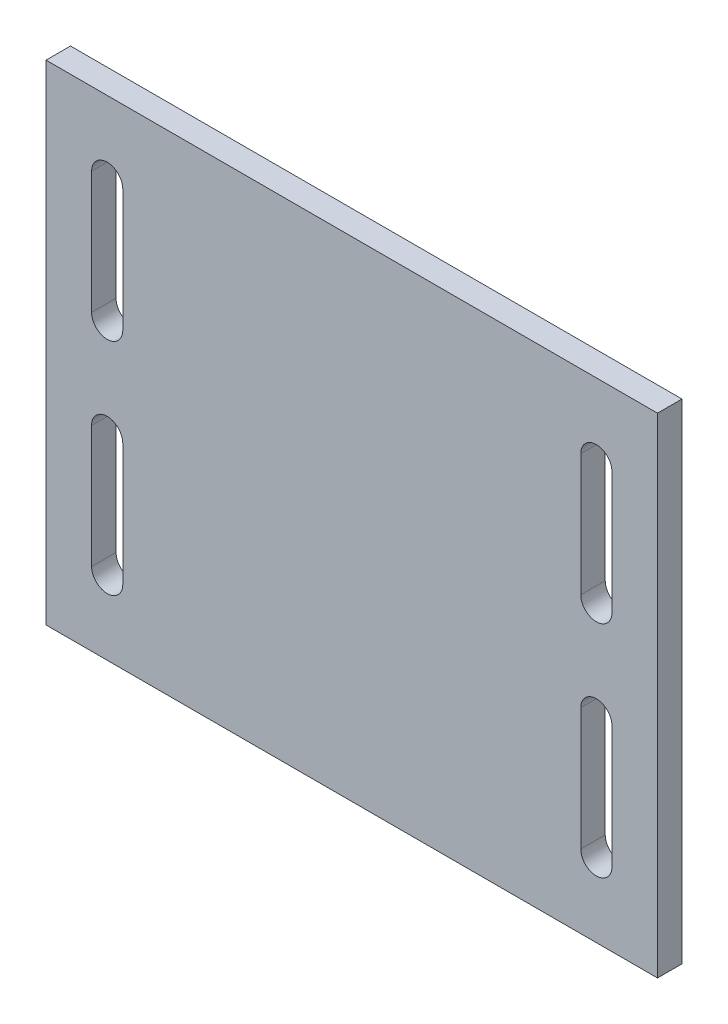
ISO-10303-21;
HEADER;
FILE_DESCRIPTION(('STEP AP214'),'2;1');
FILE_NAME('part.step','',(''),(''),'','','');
FILE_SCHEMA(('AUTOMOTIVE_DESIGN { 1 0 10303 214 1 1 1 1 }'));
ENDSEC;
DATA;
#1=APPLICATION_CONTEXT('core data for automotive mechanical design processes');
#2=APPLICATION_PROTOCOL_DEFINITION('international standard','automotive_design',2000,#1);
#3=PRODUCT_CONTEXT('',#1,'mechanical');
#4=PRODUCT('Part','Part','',(#3));
#5=PRODUCT_RELATED_PRODUCT_CATEGORY('part','',(#4));
#6=PRODUCT_DEFINITION_FORMATION('','',#4);
#7=PRODUCT_DEFINITION_CONTEXT('part definition',#1,'design');
#8=PRODUCT_DEFINITION('design','',#6,#7);
#9=PRODUCT_DEFINITION_SHAPE('','',#8);
#10=(LENGTH_UNIT() NAMED_UNIT(*) SI_UNIT(.MILLI.,.METRE.));
#11=(NAMED_UNIT(*) PLANE_ANGLE_UNIT() SI_UNIT($,.RADIAN.));
#12=(NAMED_UNIT(*) SI_UNIT($,.STERADIAN.) SOLID_ANGLE_UNIT());
#13=UNCERTAINTY_MEASURE_WITH_UNIT(LENGTH_MEASURE(1.E-05),#10,'distance_accuracy_value','');
#14=(GEOMETRIC_REPRESENTATION_CONTEXT(3) GLOBAL_UNCERTAINTY_ASSIGNED_CONTEXT((#13)) GLOBAL_UNIT_ASSIGNED_CONTEXT((#10,
#11,#12)) REPRESENTATION_CONTEXT('',''));
#15=CARTESIAN_POINT('',(0.,0.,0.));
#16=DIRECTION('',(0.,0.,1.));
#17=DIRECTION('',(1.,0.,0.));
#18=AXIS2_PLACEMENT_3D('',#15,#16,#17);
#19=CARTESIAN_POINT('',(0.,0.,4.));
#20=DIRECTION('',(0.,0.,-1.));
#21=DIRECTION('',(-1.,0.,0.));
#22=AXIS2_PLACEMENT_3D('',#19,#20,#21);
#23=PLANE('',#22);
#24=CARTESIAN_POINT('',(90.,68.,4.));
#25=DIRECTION('',(0.,0.,1.));
#26=DIRECTION('',(1.,0.,0.));
#27=AXIS2_PLACEMENT_3D('',#24,#25,#26);
#28=CIRCLE('',#27,2.54999999999998);
#29=CARTESIAN_POINT('',(92.55,68.,4.));
#30=VERTEX_POINT('',#29);
#31=CARTESIAN_POINT('',(87.45,68.,4.));
#32=VERTEX_POINT('',#31);
#33=EDGE_CURVE('E231',#30,#32,#28,.T.);
#34=ORIENTED_EDGE('',*,*,#33,.F.);
#35=DIRECTION('',(0.,1.,0.));
#36=VECTOR('',#35,1.);
#37=CARTESIAN_POINT('',(92.55,68.,4.));
#38=LINE('',#37,#36);
#39=CARTESIAN_POINT('',(92.55,48.,4.));
#40=VERTEX_POINT('',#39);
#41=EDGE_CURVE('E242',#40,#30,#38,.T.);
#42=ORIENTED_EDGE('',*,*,#41,.F.);
#43=CARTESIAN_POINT('',(90.,48.,4.));
#44=DIRECTION('',(0.,0.,1.));
#45=DIRECTION('',(1.,0.,0.));
#46=AXIS2_PLACEMENT_3D('',#43,#44,#45);
#47=CIRCLE('',#46,2.54999999999998);
#48=CARTESIAN_POINT('',(87.45,48.,4.));
#49=VERTEX_POINT('',#48);
#50=EDGE_CURVE('E238',#49,#40,#47,.T.);
#51=ORIENTED_EDGE('',*,*,#50,.F.);
#52=DIRECTION('',(0.,-1.,0.));
#53=VECTOR('',#52,1.);
#54=CARTESIAN_POINT('',(87.45,68.,4.));
#55=LINE('',#54,#53);
#56=EDGE_CURVE('E234',#32,#49,#55,.T.);
#57=ORIENTED_EDGE('',*,*,#56,.F.);
#58=EDGE_LOOP('',(#34,#42,#51,#57));
#59=FACE_BOUND('',#58,.T.);
#60=CARTESIAN_POINT('',(10.,68.,4.));
#61=DIRECTION('',(0.,0.,1.));
#62=DIRECTION('',(1.,0.,0.));
#63=AXIS2_PLACEMENT_3D('',#60,#61,#62);
#64=CIRCLE('',#63,2.55);
#65=CARTESIAN_POINT('',(12.55,68.,4.));
#66=VERTEX_POINT('',#65);
#67=CARTESIAN_POINT('',(7.45,68.,4.));
#68=VERTEX_POINT('',#67);
#69=EDGE_CURVE('E317',#66,#68,#64,.T.);
#70=ORIENTED_EDGE('',*,*,#69,.F.);
#71=DIRECTION('',(0.,1.,0.));
#72=VECTOR('',#71,1.);
#73=CARTESIAN_POINT('',(12.55,68.,4.));
#74=LINE('',#73,#72);
#75=CARTESIAN_POINT('',(12.55,48.,4.));
#76=VERTEX_POINT('',#75);
#77=EDGE_CURVE('E328',#76,#66,#74,.T.);
#78=ORIENTED_EDGE('',*,*,#77,.F.);
#79=CARTESIAN_POINT('',(10.,48.,4.));
#80=DIRECTION('',(0.,0.,1.));
#81=DIRECTION('',(1.,0.,0.));
#82=AXIS2_PLACEMENT_3D('',#79,#80,#81);
#83=CIRCLE('',#82,2.55);
#84=CARTESIAN_POINT('',(7.45,48.,4.));
#85=VERTEX_POINT('',#84);
#86=EDGE_CURVE('E324',#85,#76,#83,.T.);
#87=ORIENTED_EDGE('',*,*,#86,.F.);
#88=DIRECTION('',(0.,-1.,0.));
#89=VECTOR('',#88,1.);
#90=CARTESIAN_POINT('',(7.45,68.,4.));
#91=LINE('',#90,#89);
#92=EDGE_CURVE('E320',#68,#85,#91,.T.);
#93=ORIENTED_EDGE('',*,*,#92,.F.);
#94=EDGE_LOOP('',(#70,#78,#87,#93));
#95=FACE_BOUND('',#94,.T.);
#96=DIRECTION('',(0.,-1.,0.));
#97=VECTOR('',#96,1.);
#98=CARTESIAN_POINT('',(0.,0.,4.));
#99=LINE('',#98,#97);
#100=CARTESIAN_POINT('',(0.,80.,4.));
#101=VERTEX_POINT('',#100);
#102=CARTESIAN_POINT('',(0.,0.,4.));
#103=VERTEX_POINT('',#102);
#104=EDGE_CURVE('E360',#101,#103,#99,.T.);
#105=ORIENTED_EDGE('',*,*,#104,.T.);
#106=DIRECTION('',(1.,0.,0.));
#107=VECTOR('',#106,1.);
#108=CARTESIAN_POINT('',(0.,0.,4.));
#109=LINE('',#108,#107);
#110=CARTESIAN_POINT('',(100.,0.,4.));
#111=VERTEX_POINT('',#110);
#112=EDGE_CURVE('E364',#103,#111,#109,.T.);
#113=ORIENTED_EDGE('',*,*,#112,.T.);
#114=DIRECTION('',(0.,1.,0.));
#115=VECTOR('',#114,1.);
#116=CARTESIAN_POINT('',(100.,0.,4.));
#117=LINE('',#116,#115);
#118=CARTESIAN_POINT('',(100.,80.,4.));
#119=VERTEX_POINT('',#118);
#120=EDGE_CURVE('E368',#111,#119,#117,.T.);
#121=ORIENTED_EDGE('',*,*,#120,.T.);
#122=DIRECTION('',(-1.,0.,0.));
#123=VECTOR('',#122,1.);
#124=CARTESIAN_POINT('',(0.,80.,4.));
#125=LINE('',#124,#123);
#126=EDGE_CURVE('E371',#119,#101,#125,.T.);
#127=ORIENTED_EDGE('',*,*,#126,.T.);
#128=EDGE_LOOP('',(#105,#113,#121,#127));
#129=FACE_BOUND('',#128,.T.);
#130=CARTESIAN_POINT('',(10.,32.,4.));
#131=DIRECTION('',(0.,0.,1.));
#132=DIRECTION('',(1.,0.,0.));
#133=AXIS2_PLACEMENT_3D('',#130,#131,#132);
#134=CIRCLE('',#133,2.55);
#135=CARTESIAN_POINT('',(12.55,32.,4.));
#136=VERTEX_POINT('',#135);
#137=CARTESIAN_POINT('',(7.45,32.,4.));
#138=VERTEX_POINT('',#137);
#139=EDGE_CURVE('E274',#136,#138,#134,.T.);
#140=ORIENTED_EDGE('',*,*,#139,.F.);
#141=DIRECTION('',(0.,1.,0.));
#142=VECTOR('',#141,1.);
#143=CARTESIAN_POINT('',(12.55,32.,4.));
#144=LINE('',#143,#142);
#145=CARTESIAN_POINT('',(12.55,12.,4.));
#146=VERTEX_POINT('',#145);
#147=EDGE_CURVE('E285',#146,#136,#144,.T.);
#148=ORIENTED_EDGE('',*,*,#147,.F.);
#149=CARTESIAN_POINT('',(10.,12.,4.));
#150=DIRECTION('',(0.,0.,1.));
#151=DIRECTION('',(1.,0.,0.));
#152=AXIS2_PLACEMENT_3D('',#149,#150,#151);
#153=CIRCLE('',#152,2.55);
#154=CARTESIAN_POINT('',(7.45,12.,4.));
#155=VERTEX_POINT('',#154);
#156=EDGE_CURVE('E281',#155,#146,#153,.T.);
#157=ORIENTED_EDGE('',*,*,#156,.F.);
#158=DIRECTION('',(0.,-1.,0.));
#159=VECTOR('',#158,1.);
#160=CARTESIAN_POINT('',(7.45,32.,4.));
#161=LINE('',#160,#159);
#162=EDGE_CURVE('E277',#138,#155,#161,.T.);
#163=ORIENTED_EDGE('',*,*,#162,.F.);
#164=EDGE_LOOP('',(#140,#148,#157,#163));
#165=FACE_BOUND('',#164,.T.);
#166=CARTESIAN_POINT('',(90.,32.,4.));
#167=DIRECTION('',(0.,0.,1.));
#168=DIRECTION('',(1.,0.,0.));
#169=AXIS2_PLACEMENT_3D('',#166,#167,#168);
#170=CIRCLE('',#169,2.55);
#171=CARTESIAN_POINT('',(92.55,32.,4.));
#172=VERTEX_POINT('',#171);
#173=CARTESIAN_POINT('',(87.45,32.,4.));
#174=VERTEX_POINT('',#173);
#175=EDGE_CURVE('E183',#172,#174,#170,.T.);
#176=ORIENTED_EDGE('',*,*,#175,.F.);
#177=DIRECTION('',(0.,1.,0.));
#178=VECTOR('',#177,1.);
#179=CARTESIAN_POINT('',(92.55,32.,4.));
#180=LINE('',#179,#178);
#181=CARTESIAN_POINT('',(92.55,12.,4.));
#182=VERTEX_POINT('',#181);
#183=EDGE_CURVE('E209',#182,#172,#180,.T.);
#184=ORIENTED_EDGE('',*,*,#183,.F.);
#185=CARTESIAN_POINT('',(90.,12.,4.));
#186=DIRECTION('',(0.,0.,1.));
#187=DIRECTION('',(1.,0.,0.));
#188=AXIS2_PLACEMENT_3D('',#185,#186,#187);
#189=CIRCLE('',#188,2.54999999999998);
#190=CARTESIAN_POINT('',(87.45,12.,4.));
#191=VERTEX_POINT('',#190);
#192=EDGE_CURVE('E205',#191,#182,#189,.T.);
#193=ORIENTED_EDGE('',*,*,#192,.F.);
#194=DIRECTION('',(0.,-1.,0.));
#195=VECTOR('',#194,1.);
#196=CARTESIAN_POINT('',(87.45,32.,4.));
#197=LINE('',#196,#195);
#198=EDGE_CURVE('E192',#174,#191,#197,.T.);
#199=ORIENTED_EDGE('',*,*,#198,.F.);
#200=EDGE_LOOP('',(#176,#184,#193,#199));
#201=FACE_BOUND('',#200,.T.);
#202=ADVANCED_FACE('F45',(#59,#95,#129,#165,#201),#23,.F.);
#203=CARTESIAN_POINT('',(0.,0.,0.));
#204=DIRECTION('',(0.,0.,-1.));
#205=DIRECTION('',(-1.,0.,0.));
#206=AXIS2_PLACEMENT_3D('',#203,#204,#205);
#207=PLANE('',#206);
#208=DIRECTION('',(0.,-1.,0.));
#209=VECTOR('',#208,1.);
#210=CARTESIAN_POINT('',(0.,0.,0.));
#211=LINE('',#210,#209);
#212=CARTESIAN_POINT('',(0.,80.,0.));
#213=VERTEX_POINT('',#212);
#214=CARTESIAN_POINT('',(0.,0.,0.));
#215=VERTEX_POINT('',#214);
#216=EDGE_CURVE('E359',#213,#215,#211,.T.);
#217=ORIENTED_EDGE('',*,*,#216,.F.);
#218=DIRECTION('',(-1.,0.,0.));
#219=VECTOR('',#218,1.);
#220=CARTESIAN_POINT('',(0.,80.,0.));
#221=LINE('',#220,#219);
#222=CARTESIAN_POINT('',(100.,80.,0.));
#223=VERTEX_POINT('',#222);
#224=EDGE_CURVE('E365',#223,#213,#221,.T.);
#225=ORIENTED_EDGE('',*,*,#224,.F.);
#226=DIRECTION('',(0.,1.,0.));
#227=VECTOR('',#226,1.);
#228=CARTESIAN_POINT('',(100.,0.,0.));
#229=LINE('',#228,#227);
#230=CARTESIAN_POINT('',(100.,0.,0.));
#231=VERTEX_POINT('',#230);
#232=EDGE_CURVE('E381',#231,#223,#229,.T.);
#233=ORIENTED_EDGE('',*,*,#232,.F.);
#234=DIRECTION('',(1.,0.,0.));
#235=VECTOR('',#234,1.);
#236=CARTESIAN_POINT('',(0.,0.,0.));
#237=LINE('',#236,#235);
#238=EDGE_CURVE('E378',#215,#231,#237,.T.);
#239=ORIENTED_EDGE('',*,*,#238,.F.);
#240=EDGE_LOOP('',(#217,#225,#233,#239));
#241=FACE_BOUND('',#240,.T.);
#242=DIRECTION('',(0.,1.,0.));
#243=VECTOR('',#242,1.);
#244=CARTESIAN_POINT('',(12.55,68.,0.));
#245=LINE('',#244,#243);
#246=CARTESIAN_POINT('',(12.55,48.,0.));
#247=VERTEX_POINT('',#246);
#248=CARTESIAN_POINT('',(12.55,68.,0.));
#249=VERTEX_POINT('',#248);
#250=EDGE_CURVE('E321',#247,#249,#245,.T.);
#251=ORIENTED_EDGE('',*,*,#250,.T.);
#252=CARTESIAN_POINT('',(10.,68.,0.));
#253=DIRECTION('',(0.,0.,1.));
#254=DIRECTION('',(1.,0.,0.));
#255=AXIS2_PLACEMENT_3D('',#252,#253,#254);
#256=CIRCLE('',#255,2.55);
#257=CARTESIAN_POINT('',(7.45,68.,0.));
#258=VERTEX_POINT('',#257);
#259=EDGE_CURVE('E316',#249,#258,#256,.T.);
#260=ORIENTED_EDGE('',*,*,#259,.T.);
#261=DIRECTION('',(0.,-1.,0.));
#262=VECTOR('',#261,1.);
#263=CARTESIAN_POINT('',(7.45,68.,0.));
#264=LINE('',#263,#262);
#265=CARTESIAN_POINT('',(7.45,48.,0.));
#266=VERTEX_POINT('',#265);
#267=EDGE_CURVE('E335',#258,#266,#264,.T.);
#268=ORIENTED_EDGE('',*,*,#267,.T.);
#269=CARTESIAN_POINT('',(10.,48.,0.));
#270=DIRECTION('',(0.,0.,1.));
#271=DIRECTION('',(1.,0.,0.));
#272=AXIS2_PLACEMENT_3D('',#269,#270,#271);
#273=CIRCLE('',#272,2.55);
#274=EDGE_CURVE('E339',#266,#247,#273,.T.);
#275=ORIENTED_EDGE('',*,*,#274,.T.);
#276=EDGE_LOOP('',(#251,#260,#268,#275));
#277=FACE_BOUND('',#276,.T.);
#278=DIRECTION('',(0.,1.,0.));
#279=VECTOR('',#278,1.);
#280=CARTESIAN_POINT('',(12.55,32.,0.));
#281=LINE('',#280,#279);
#282=CARTESIAN_POINT('',(12.55,12.,0.));
#283=VERTEX_POINT('',#282);
#284=CARTESIAN_POINT('',(12.55,32.,0.));
#285=VERTEX_POINT('',#284);
#286=EDGE_CURVE('E278',#283,#285,#281,.T.);
#287=ORIENTED_EDGE('',*,*,#286,.T.);
#288=CARTESIAN_POINT('',(10.,32.,0.));
#289=DIRECTION('',(0.,0.,1.));
#290=DIRECTION('',(1.,0.,0.));
#291=AXIS2_PLACEMENT_3D('',#288,#289,#290);
#292=CIRCLE('',#291,2.55);
#293=CARTESIAN_POINT('',(7.45,32.,0.));
#294=VERTEX_POINT('',#293);
#295=EDGE_CURVE('E273',#285,#294,#292,.T.);
#296=ORIENTED_EDGE('',*,*,#295,.T.);
#297=DIRECTION('',(0.,-1.,0.));
#298=VECTOR('',#297,1.);
#299=CARTESIAN_POINT('',(7.45,32.,0.));
#300=LINE('',#299,#298);
#301=CARTESIAN_POINT('',(7.45,12.,0.));
#302=VERTEX_POINT('',#301);
#303=EDGE_CURVE('E292',#294,#302,#300,.T.);
#304=ORIENTED_EDGE('',*,*,#303,.T.);
#305=CARTESIAN_POINT('',(10.,12.,0.));
#306=DIRECTION('',(0.,0.,1.));
#307=DIRECTION('',(1.,0.,0.));
#308=AXIS2_PLACEMENT_3D('',#305,#306,#307);
#309=CIRCLE('',#308,2.55);
#310=EDGE_CURVE('E296',#302,#283,#309,.T.);
#311=ORIENTED_EDGE('',*,*,#310,.T.);
#312=EDGE_LOOP('',(#287,#296,#304,#311));
#313=FACE_BOUND('',#312,.T.);
#314=DIRECTION('',(0.,1.,0.));
#315=VECTOR('',#314,1.);
#316=CARTESIAN_POINT('',(92.55,68.,0.));
#317=LINE('',#316,#315);
#318=CARTESIAN_POINT('',(92.55,48.,0.));
#319=VERTEX_POINT('',#318);
#320=CARTESIAN_POINT('',(92.55,68.,0.));
#321=VERTEX_POINT('',#320);
#322=EDGE_CURVE('E235',#319,#321,#317,.T.);
#323=ORIENTED_EDGE('',*,*,#322,.T.);
#324=CARTESIAN_POINT('',(90.,68.,0.));
#325=DIRECTION('',(0.,0.,1.));
#326=DIRECTION('',(1.,0.,0.));
#327=AXIS2_PLACEMENT_3D('',#324,#325,#326);
#328=CIRCLE('',#327,2.54999999999998);
#329=CARTESIAN_POINT('',(87.45,68.,0.));
#330=VERTEX_POINT('',#329);
#331=EDGE_CURVE('E201',#321,#330,#328,.T.);
#332=ORIENTED_EDGE('',*,*,#331,.T.);
#333=DIRECTION('',(0.,-1.,0.));
#334=VECTOR('',#333,1.);
#335=CARTESIAN_POINT('',(87.45,68.,0.));
#336=LINE('',#335,#334);
#337=CARTESIAN_POINT('',(87.45,48.,0.));
#338=VERTEX_POINT('',#337);
#339=EDGE_CURVE('E249',#330,#338,#336,.T.);
#340=ORIENTED_EDGE('',*,*,#339,.T.);
#341=CARTESIAN_POINT('',(90.,48.,0.));
#342=DIRECTION('',(0.,0.,1.));
#343=DIRECTION('',(1.,0.,0.));
#344=AXIS2_PLACEMENT_3D('',#341,#342,#343);
#345=CIRCLE('',#344,2.54999999999998);
#346=EDGE_CURVE('E253',#338,#319,#345,.T.);
#347=ORIENTED_EDGE('',*,*,#346,.T.);
#348=EDGE_LOOP('',(#323,#332,#340,#347));
#349=FACE_BOUND('',#348,.T.);
#350=DIRECTION('',(0.,1.,0.));
#351=VECTOR('',#350,1.);
#352=CARTESIAN_POINT('',(92.55,32.,0.));
#353=LINE('',#352,#351);
#354=CARTESIAN_POINT('',(92.55,12.,0.));
#355=VERTEX_POINT('',#354);
#356=CARTESIAN_POINT('',(92.55,32.,0.));
#357=VERTEX_POINT('',#356);
#358=EDGE_CURVE('E193',#355,#357,#353,.T.);
#359=ORIENTED_EDGE('',*,*,#358,.T.);
#360=CARTESIAN_POINT('',(90.,32.,0.));
#361=DIRECTION('',(0.,0.,1.));
#362=DIRECTION('',(1.,0.,0.));
#363=AXIS2_PLACEMENT_3D('',#360,#361,#362);
#364=CIRCLE('',#363,2.55);
#365=CARTESIAN_POINT('',(87.45,32.,0.));
#366=VERTEX_POINT('',#365);
#367=EDGE_CURVE('E69',#357,#366,#364,.T.);
#368=ORIENTED_EDGE('',*,*,#367,.T.);
#369=DIRECTION('',(0.,-1.,0.));
#370=VECTOR('',#369,1.);
#371=CARTESIAN_POINT('',(87.45,32.,0.));
#372=LINE('',#371,#370);
#373=CARTESIAN_POINT('',(87.45,12.,0.));
#374=VERTEX_POINT('',#373);
#375=EDGE_CURVE('E199',#366,#374,#372,.T.);
#376=ORIENTED_EDGE('',*,*,#375,.T.);
#377=CARTESIAN_POINT('',(90.,12.,0.));
#378=DIRECTION('',(0.,0.,1.));
#379=DIRECTION('',(1.,0.,0.));
#380=AXIS2_PLACEMENT_3D('',#377,#378,#379);
#381=CIRCLE('',#380,2.54999999999998);
#382=EDGE_CURVE('E218',#374,#355,#381,.T.);
#383=ORIENTED_EDGE('',*,*,#382,.T.);
#384=EDGE_LOOP('',(#359,#368,#376,#383));
#385=FACE_BOUND('',#384,.T.);
#386=ADVANCED_FACE('F404',(#241,#277,#313,#349,#385),#207,.T.);
#387=CARTESIAN_POINT('',(0.,0.,4.));
#388=DIRECTION('',(1.,0.,0.));
#389=DIRECTION('',(0.,0.,-1.));
#390=AXIS2_PLACEMENT_3D('',#387,#388,#389);
#391=PLANE('',#390);
#392=ORIENTED_EDGE('',*,*,#216,.T.);
#393=DIRECTION('',(0.,0.,-1.));
#394=VECTOR('',#393,1.);
#395=CARTESIAN_POINT('',(0.,0.,4.));
#396=LINE('',#395,#394);
#397=EDGE_CURVE('E11',#103,#215,#396,.T.);
#398=ORIENTED_EDGE('',*,*,#397,.F.);
#399=ORIENTED_EDGE('',*,*,#104,.F.);
#400=DIRECTION('',(0.,0.,-1.));
#401=VECTOR('',#400,1.);
#402=CARTESIAN_POINT('',(0.,80.,4.));
#403=LINE('',#402,#401);
#404=EDGE_CURVE('E374',#101,#213,#403,.T.);
#405=ORIENTED_EDGE('',*,*,#404,.T.);
#406=EDGE_LOOP('',(#392,#398,#399,#405));
#407=FACE_BOUND('',#406,.T.);
#408=ADVANCED_FACE('F47',(#407),#391,.F.);
#409=CARTESIAN_POINT('',(0.,0.,4.));
#410=DIRECTION('',(0.,1.,0.));
#411=DIRECTION('',(0.,0.,1.));
#412=AXIS2_PLACEMENT_3D('',#409,#410,#411);
#413=PLANE('',#412);
#414=ORIENTED_EDGE('',*,*,#238,.T.);
#415=DIRECTION('',(0.,0.,-1.));
#416=VECTOR('',#415,1.);
#417=CARTESIAN_POINT('',(100.,0.,4.));
#418=LINE('',#417,#416);
#419=EDGE_CURVE('E54',#111,#231,#418,.T.);
#420=ORIENTED_EDGE('',*,*,#419,.F.);
#421=ORIENTED_EDGE('',*,*,#112,.F.);
#422=ORIENTED_EDGE('',*,*,#397,.T.);
#423=EDGE_LOOP('',(#414,#420,#421,#422));
#424=FACE_BOUND('',#423,.T.);
#425=ADVANCED_FACE('F415',(#424),#413,.F.);
#426=CARTESIAN_POINT('',(100.,0.,4.));
#427=DIRECTION('',(-1.,0.,0.));
#428=DIRECTION('',(0.,0.,1.));
#429=AXIS2_PLACEMENT_3D('',#426,#427,#428);
#430=PLANE('',#429);
#431=ORIENTED_EDGE('',*,*,#232,.T.);
#432=DIRECTION('',(0.,0.,-1.));
#433=VECTOR('',#432,1.);
#434=CARTESIAN_POINT('',(100.,80.,4.));
#435=LINE('',#434,#433);
#436=EDGE_CURVE('E389',#119,#223,#435,.T.);
#437=ORIENTED_EDGE('',*,*,#436,.F.);
#438=ORIENTED_EDGE('',*,*,#120,.F.);
#439=ORIENTED_EDGE('',*,*,#419,.T.);
#440=EDGE_LOOP('',(#431,#437,#438,#439));
#441=FACE_BOUND('',#440,.T.);
#442=ADVANCED_FACE('F398',(#441),#430,.F.);
#443=CARTESIAN_POINT('',(0.,80.,4.));
#444=DIRECTION('',(0.,-1.,0.));
#445=DIRECTION('',(0.,0.,-1.));
#446=AXIS2_PLACEMENT_3D('',#443,#444,#445);
#447=PLANE('',#446);
#448=ORIENTED_EDGE('',*,*,#224,.T.);
#449=ORIENTED_EDGE('',*,*,#404,.F.);
#450=ORIENTED_EDGE('',*,*,#126,.F.);
#451=ORIENTED_EDGE('',*,*,#436,.T.);
#452=EDGE_LOOP('',(#448,#449,#450,#451));
#453=FACE_BOUND('',#452,.T.);
#454=ADVANCED_FACE('F408',(#453),#447,.F.);
#455=CARTESIAN_POINT('',(10.,68.,4.));
#456=DIRECTION('',(0.,0.,-1.));
#457=DIRECTION('',(-1.,0.,0.));
#458=AXIS2_PLACEMENT_3D('',#455,#456,#457);
#459=CYLINDRICAL_SURFACE('',#458,2.55);
#460=ORIENTED_EDGE('',*,*,#259,.F.);
#461=DIRECTION('',(0.,0.,-1.));
#462=VECTOR('',#461,1.);
#463=CARTESIAN_POINT('',(12.55,68.,4.));
#464=LINE('',#463,#462);
#465=EDGE_CURVE('E331',#66,#249,#464,.T.);
#466=ORIENTED_EDGE('',*,*,#465,.F.);
#467=ORIENTED_EDGE('',*,*,#69,.T.);
#468=DIRECTION('',(0.,0.,-1.));
#469=VECTOR('',#468,1.);
#470=CARTESIAN_POINT('',(7.45,68.,4.));
#471=LINE('',#470,#469);
#472=EDGE_CURVE('E355',#68,#258,#471,.T.);
#473=ORIENTED_EDGE('',*,*,#472,.T.);
#474=EDGE_LOOP('',(#460,#466,#467,#473));
#475=FACE_BOUND('',#474,.T.);
#476=ADVANCED_FACE('F432',(#475),#459,.F.);
#477=CARTESIAN_POINT('',(7.45,68.,4.));
#478=DIRECTION('',(1.,0.,0.));
#479=DIRECTION('',(0.,1.,0.));
#480=AXIS2_PLACEMENT_3D('',#477,#478,#479);
#481=PLANE('',#480);
#482=ORIENTED_EDGE('',*,*,#267,.F.);
#483=ORIENTED_EDGE('',*,*,#472,.F.);
#484=ORIENTED_EDGE('',*,*,#92,.T.);
#485=DIRECTION('',(0.,0.,-1.));
#486=VECTOR('',#485,1.);
#487=CARTESIAN_POINT('',(7.45,48.,4.));
#488=LINE('',#487,#486);
#489=EDGE_CURVE('E352',#85,#266,#488,.T.);
#490=ORIENTED_EDGE('',*,*,#489,.T.);
#491=EDGE_LOOP('',(#482,#483,#484,#490));
#492=FACE_BOUND('',#491,.T.);
#493=ADVANCED_FACE('F439',(#492),#481,.T.);
#494=CARTESIAN_POINT('',(10.,48.,4.));
#495=DIRECTION('',(0.,0.,-1.));
#496=DIRECTION('',(-1.,0.,0.));
#497=AXIS2_PLACEMENT_3D('',#494,#495,#496);
#498=CYLINDRICAL_SURFACE('',#497,2.55);
#499=ORIENTED_EDGE('',*,*,#274,.F.);
#500=ORIENTED_EDGE('',*,*,#489,.F.);
#501=ORIENTED_EDGE('',*,*,#86,.T.);
#502=DIRECTION('',(0.,0.,-1.));
#503=VECTOR('',#502,1.);
#504=CARTESIAN_POINT('',(12.55,48.,4.));
#505=LINE('',#504,#503);
#506=EDGE_CURVE('E349',#76,#247,#505,.T.);
#507=ORIENTED_EDGE('',*,*,#506,.T.);
#508=EDGE_LOOP('',(#499,#500,#501,#507));
#509=FACE_BOUND('',#508,.T.);
#510=ADVANCED_FACE('F444',(#509),#498,.F.);
#511=CARTESIAN_POINT('',(12.55,68.,4.));
#512=DIRECTION('',(-1.,0.,0.));
#513=DIRECTION('',(0.,0.,1.));
#514=AXIS2_PLACEMENT_3D('',#511,#512,#513);
#515=PLANE('',#514);
#516=ORIENTED_EDGE('',*,*,#250,.F.);
#517=ORIENTED_EDGE('',*,*,#506,.F.);
#518=ORIENTED_EDGE('',*,*,#77,.T.);
#519=ORIENTED_EDGE('',*,*,#465,.T.);
#520=EDGE_LOOP('',(#516,#517,#518,#519));
#521=FACE_BOUND('',#520,.T.);
#522=ADVANCED_FACE('F451',(#521),#515,.T.);
#523=CARTESIAN_POINT('',(10.,32.,4.));
#524=DIRECTION('',(0.,0.,-1.));
#525=DIRECTION('',(-1.,0.,0.));
#526=AXIS2_PLACEMENT_3D('',#523,#524,#525);
#527=CYLINDRICAL_SURFACE('',#526,2.55);
#528=ORIENTED_EDGE('',*,*,#295,.F.);
#529=DIRECTION('',(0.,0.,-1.));
#530=VECTOR('',#529,1.);
#531=CARTESIAN_POINT('',(12.55,32.,4.));
#532=LINE('',#531,#530);
#533=EDGE_CURVE('E288',#136,#285,#532,.T.);
#534=ORIENTED_EDGE('',*,*,#533,.F.);
#535=ORIENTED_EDGE('',*,*,#139,.T.);
#536=DIRECTION('',(0.,0.,-1.));
#537=VECTOR('',#536,1.);
#538=CARTESIAN_POINT('',(7.45,32.,4.));
#539=LINE('',#538,#537);
#540=EDGE_CURVE('E312',#138,#294,#539,.T.);
#541=ORIENTED_EDGE('',*,*,#540,.T.);
#542=EDGE_LOOP('',(#528,#534,#535,#541));
#543=FACE_BOUND('',#542,.T.);
#544=ADVANCED_FACE('F464',(#543),#527,.F.);
#545=CARTESIAN_POINT('',(7.45,32.,4.));
#546=DIRECTION('',(1.,0.,0.));
#547=DIRECTION('',(0.,1.,0.));
#548=AXIS2_PLACEMENT_3D('',#545,#546,#547);
#549=PLANE('',#548);
#550=ORIENTED_EDGE('',*,*,#303,.F.);
#551=ORIENTED_EDGE('',*,*,#540,.F.);
#552=ORIENTED_EDGE('',*,*,#162,.T.);
#553=DIRECTION('',(0.,0.,-1.));
#554=VECTOR('',#553,1.);
#555=CARTESIAN_POINT('',(7.45,12.,4.));
#556=LINE('',#555,#554);
#557=EDGE_CURVE('E309',#155,#302,#556,.T.);
#558=ORIENTED_EDGE('',*,*,#557,.T.);
#559=EDGE_LOOP('',(#550,#551,#552,#558));
#560=FACE_BOUND('',#559,.T.);
#561=ADVANCED_FACE('F469',(#560),#549,.T.);
#562=CARTESIAN_POINT('',(10.,12.,4.));
#563=DIRECTION('',(0.,0.,-1.));
#564=DIRECTION('',(-1.,0.,0.));
#565=AXIS2_PLACEMENT_3D('',#562,#563,#564);
#566=CYLINDRICAL_SURFACE('',#565,2.55);
#567=ORIENTED_EDGE('',*,*,#310,.F.);
#568=ORIENTED_EDGE('',*,*,#557,.F.);
#569=ORIENTED_EDGE('',*,*,#156,.T.);
#570=DIRECTION('',(0.,0.,-1.));
#571=VECTOR('',#570,1.);
#572=CARTESIAN_POINT('',(12.55,12.,4.));
#573=LINE('',#572,#571);
#574=EDGE_CURVE('E306',#146,#283,#573,.T.);
#575=ORIENTED_EDGE('',*,*,#574,.T.);
#576=EDGE_LOOP('',(#567,#568,#569,#575));
#577=FACE_BOUND('',#576,.T.);
#578=ADVANCED_FACE('F473',(#577),#566,.F.);
#579=CARTESIAN_POINT('',(12.55,32.,4.));
#580=DIRECTION('',(-1.,0.,0.));
#581=DIRECTION('',(0.,-1.,0.));
#582=AXIS2_PLACEMENT_3D('',#579,#580,#581);
#583=PLANE('',#582);
#584=ORIENTED_EDGE('',*,*,#286,.F.);
#585=ORIENTED_EDGE('',*,*,#574,.F.);
#586=ORIENTED_EDGE('',*,*,#147,.T.);
#587=ORIENTED_EDGE('',*,*,#533,.T.);
#588=EDGE_LOOP('',(#584,#585,#586,#587));
#589=FACE_BOUND('',#588,.T.);
#590=ADVANCED_FACE('F477',(#589),#583,.T.);
#591=CARTESIAN_POINT('',(90.,68.,4.));
#592=DIRECTION('',(0.,0.,-1.));
#593=DIRECTION('',(-1.,0.,0.));
#594=AXIS2_PLACEMENT_3D('',#591,#592,#593);
#595=CYLINDRICAL_SURFACE('',#594,2.54999999999998);
#596=ORIENTED_EDGE('',*,*,#331,.F.);
#597=DIRECTION('',(0.,0.,-1.));
#598=VECTOR('',#597,1.);
#599=CARTESIAN_POINT('',(92.55,68.,4.));
#600=LINE('',#599,#598);
#601=EDGE_CURVE('E245',#30,#321,#600,.T.);
#602=ORIENTED_EDGE('',*,*,#601,.F.);
#603=ORIENTED_EDGE('',*,*,#33,.T.);
#604=DIRECTION('',(0.,0.,-1.));
#605=VECTOR('',#604,1.);
#606=CARTESIAN_POINT('',(87.45,68.,4.));
#607=LINE('',#606,#605);
#608=EDGE_CURVE('E269',#32,#330,#607,.T.);
#609=ORIENTED_EDGE('',*,*,#608,.T.);
#610=EDGE_LOOP('',(#596,#602,#603,#609));
#611=FACE_BOUND('',#610,.T.);
#612=ADVANCED_FACE('F481',(#611),#595,.F.);
#613=CARTESIAN_POINT('',(87.45,68.,4.));
#614=DIRECTION('',(1.,0.,0.));
#615=DIRECTION('',(0.,0.,-1.));
#616=AXIS2_PLACEMENT_3D('',#613,#614,#615);
#617=PLANE('',#616);
#618=ORIENTED_EDGE('',*,*,#339,.F.);
#619=ORIENTED_EDGE('',*,*,#608,.F.);
#620=ORIENTED_EDGE('',*,*,#56,.T.);
#621=DIRECTION('',(0.,0.,-1.));
#622=VECTOR('',#621,1.);
#623=CARTESIAN_POINT('',(87.45,48.,4.));
#624=LINE('',#623,#622);
#625=EDGE_CURVE('E266',#49,#338,#624,.T.);
#626=ORIENTED_EDGE('',*,*,#625,.T.);
#627=EDGE_LOOP('',(#618,#619,#620,#626));
#628=FACE_BOUND('',#627,.T.);
#629=ADVANCED_FACE('F485',(#628),#617,.T.);
#630=CARTESIAN_POINT('',(90.,48.,4.));
#631=DIRECTION('',(0.,0.,-1.));
#632=DIRECTION('',(-1.,0.,0.));
#633=AXIS2_PLACEMENT_3D('',#630,#631,#632);
#634=CYLINDRICAL_SURFACE('',#633,2.54999999999998);
#635=ORIENTED_EDGE('',*,*,#346,.F.);
#636=ORIENTED_EDGE('',*,*,#625,.F.);
#637=ORIENTED_EDGE('',*,*,#50,.T.);
#638=DIRECTION('',(0.,0.,-1.));
#639=VECTOR('',#638,1.);
#640=CARTESIAN_POINT('',(92.55,48.,4.));
#641=LINE('',#640,#639);
#642=EDGE_CURVE('E263',#40,#319,#641,.T.);
#643=ORIENTED_EDGE('',*,*,#642,.T.);
#644=EDGE_LOOP('',(#635,#636,#637,#643));
#645=FACE_BOUND('',#644,.T.);
#646=ADVANCED_FACE('F489',(#645),#634,.F.);
#647=CARTESIAN_POINT('',(92.55,68.,4.));
#648=DIRECTION('',(-1.,0.,0.));
#649=DIRECTION('',(0.,0.,1.));
#650=AXIS2_PLACEMENT_3D('',#647,#648,#649);
#651=PLANE('',#650);
#652=ORIENTED_EDGE('',*,*,#322,.F.);
#653=ORIENTED_EDGE('',*,*,#642,.F.);
#654=ORIENTED_EDGE('',*,*,#41,.T.);
#655=ORIENTED_EDGE('',*,*,#601,.T.);
#656=EDGE_LOOP('',(#652,#653,#654,#655));
#657=FACE_BOUND('',#656,.T.);
#658=ADVANCED_FACE('F493',(#657),#651,.T.);
#659=CARTESIAN_POINT('',(90.,32.,4.));
#660=DIRECTION('',(0.,0.,-1.));
#661=DIRECTION('',(-1.,0.,0.));
#662=AXIS2_PLACEMENT_3D('',#659,#660,#661);
#663=CYLINDRICAL_SURFACE('',#662,2.55);
#664=ORIENTED_EDGE('',*,*,#367,.F.);
#665=DIRECTION('',(0.,0.,-1.));
#666=VECTOR('',#665,1.);
#667=CARTESIAN_POINT('',(92.55,32.,4.));
#668=LINE('',#667,#666);
#669=EDGE_CURVE('E187',#172,#357,#668,.T.);
#670=ORIENTED_EDGE('',*,*,#669,.F.);
#671=ORIENTED_EDGE('',*,*,#175,.T.);
#672=DIRECTION('',(0.,0.,-1.));
#673=VECTOR('',#672,1.);
#674=CARTESIAN_POINT('',(87.45,32.,4.));
#675=LINE('',#674,#673);
#676=EDGE_CURVE('E186',#174,#366,#675,.T.);
#677=ORIENTED_EDGE('',*,*,#676,.T.);
#678=EDGE_LOOP('',(#664,#670,#671,#677));
#679=FACE_BOUND('',#678,.T.);
#680=ADVANCED_FACE('F185',(#679),#663,.F.);
#681=CARTESIAN_POINT('',(87.45,32.,4.));
#682=DIRECTION('',(1.,0.,0.));
#683=DIRECTION('',(0.,1.,0.));
#684=AXIS2_PLACEMENT_3D('',#681,#682,#683);
#685=PLANE('',#684);
#686=ORIENTED_EDGE('',*,*,#375,.F.);
#687=ORIENTED_EDGE('',*,*,#676,.F.);
#688=ORIENTED_EDGE('',*,*,#198,.T.);
#689=DIRECTION('',(0.,0.,-1.));
#690=VECTOR('',#689,1.);
#691=CARTESIAN_POINT('',(87.45,12.,4.));
#692=LINE('',#691,#690);
#693=EDGE_CURVE('E202',#191,#374,#692,.T.);
#694=ORIENTED_EDGE('',*,*,#693,.T.);
#695=EDGE_LOOP('',(#686,#687,#688,#694));
#696=FACE_BOUND('',#695,.T.);
#697=ADVANCED_FACE('F196',(#696),#685,.T.);
#698=CARTESIAN_POINT('',(90.,12.,4.));
#699=DIRECTION('',(0.,0.,-1.));
#700=DIRECTION('',(-1.,0.,0.));
#701=AXIS2_PLACEMENT_3D('',#698,#699,#700);
#702=CYLINDRICAL_SURFACE('',#701,2.54999999999998);
#703=ORIENTED_EDGE('',*,*,#382,.F.);
#704=ORIENTED_EDGE('',*,*,#693,.F.);
#705=ORIENTED_EDGE('',*,*,#192,.T.);
#706=DIRECTION('',(0.,0.,-1.));
#707=VECTOR('',#706,1.);
#708=CARTESIAN_POINT('',(92.55,12.,4.));
#709=LINE('',#708,#707);
#710=EDGE_CURVE('E61',#182,#355,#709,.T.);
#711=ORIENTED_EDGE('',*,*,#710,.T.);
#712=EDGE_LOOP('',(#703,#704,#705,#711));
#713=FACE_BOUND('',#712,.T.);
#714=ADVANCED_FACE('F502',(#713),#702,.F.);
#715=CARTESIAN_POINT('',(92.55,32.,4.));
#716=DIRECTION('',(-1.,0.,0.));
#717=DIRECTION('',(0.,-1.,0.));
#718=AXIS2_PLACEMENT_3D('',#715,#716,#717);
#719=PLANE('',#718);
#720=ORIENTED_EDGE('',*,*,#358,.F.);
#721=ORIENTED_EDGE('',*,*,#710,.F.);
#722=ORIENTED_EDGE('',*,*,#183,.T.);
#723=ORIENTED_EDGE('',*,*,#669,.T.);
#724=EDGE_LOOP('',(#720,#721,#722,#723));
#725=FACE_BOUND('',#724,.T.);
#726=ADVANCED_FACE('F505',(#725),#719,.T.);
#727=CLOSED_SHELL('',(#202,#386,#408,#425,#442,#454,#476,#493,#510,#522,#544,#561,#578,#590,
#612,#629,#646,#658,#680,#697,#714,#726));
#728=MANIFOLD_SOLID_BREP('B2',#727);
#729=ADVANCED_BREP_SHAPE_REPRESENTATION('',(#18,#728),#14);
#730=SHAPE_DEFINITION_REPRESENTATION(#9,#729);
ENDSEC;
END-ISO-10303-21;
